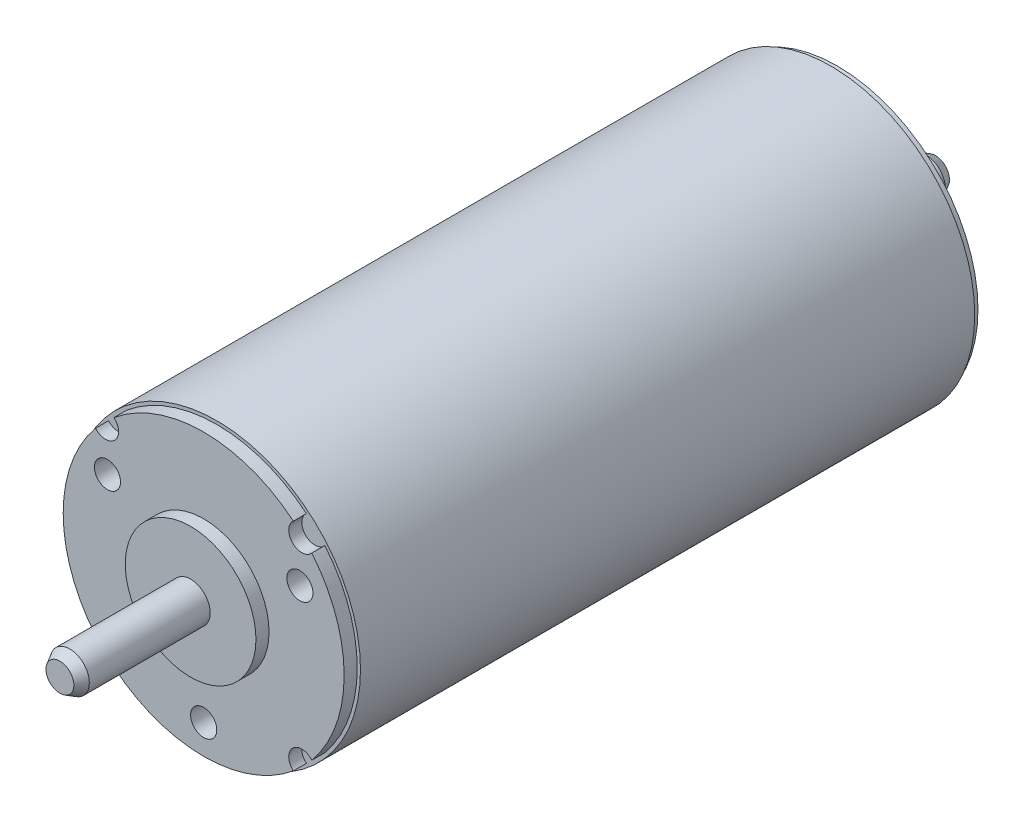
ISO-10303-21;
HEADER;
FILE_DESCRIPTION(('STEP AP214'),'2;1');
FILE_NAME('part.step','',(''),(''),'','','');
FILE_SCHEMA(('AUTOMOTIVE_DESIGN { 1 0 10303 214 1 1 1 1 }'));
ENDSEC;
DATA;
#1=APPLICATION_CONTEXT('core data for automotive mechanical design processes');
#2=APPLICATION_PROTOCOL_DEFINITION('international standard','automotive_design',2000,#1);
#3=PRODUCT_CONTEXT('',#1,'mechanical');
#4=PRODUCT('Part','Part','',(#3));
#5=PRODUCT_RELATED_PRODUCT_CATEGORY('part','',(#4));
#6=PRODUCT_DEFINITION_FORMATION('','',#4);
#7=PRODUCT_DEFINITION_CONTEXT('part definition',#1,'design');
#8=PRODUCT_DEFINITION('design','',#6,#7);
#9=PRODUCT_DEFINITION_SHAPE('','',#8);
#10=(LENGTH_UNIT() NAMED_UNIT(*) SI_UNIT(.MILLI.,.METRE.));
#11=(NAMED_UNIT(*) PLANE_ANGLE_UNIT() SI_UNIT($,.RADIAN.));
#12=(NAMED_UNIT(*) SI_UNIT($,.STERADIAN.) SOLID_ANGLE_UNIT());
#13=UNCERTAINTY_MEASURE_WITH_UNIT(LENGTH_MEASURE(1.E-05),#10,'distance_accuracy_value','');
#14=(GEOMETRIC_REPRESENTATION_CONTEXT(3) GLOBAL_UNCERTAINTY_ASSIGNED_CONTEXT((#13)) GLOBAL_UNIT_ASSIGNED_CONTEXT((#10,
#11,#12)) REPRESENTATION_CONTEXT('',''));
#15=CARTESIAN_POINT('',(0.,0.,0.));
#16=DIRECTION('',(0.,0.,1.));
#17=DIRECTION('',(1.,0.,0.));
#18=AXIS2_PLACEMENT_3D('',#15,#16,#17);
#19=CARTESIAN_POINT('',(0.,0.,48.));
#20=DIRECTION('',(0.,0.,1.));
#21=DIRECTION('',(1.,0.,0.));
#22=AXIS2_PLACEMENT_3D('',#19,#20,#21);
#23=PLANE('',#22);
#24=CARTESIAN_POINT('',(-7.36121593216777,4.24999999999993,48.));
#25=DIRECTION('',(0.,0.,1.));
#26=DIRECTION('',(-0.499999999999992,-0.866025403784443,0.));
#27=AXIS2_PLACEMENT_3D('',#24,#25,#26);
#28=CIRCLE('',#27,1.);
#29=CARTESIAN_POINT('',(-7.86121593216776,3.38397459621549,48.));
#30=VERTEX_POINT('',#29);
#31=EDGE_CURVE('E244',#30,#30,#28,.T.);
#32=ORIENTED_EDGE('',*,*,#31,.F.);
#33=EDGE_LOOP('',(#32));
#34=FACE_BOUND('',#33,.T.);
#35=CARTESIAN_POINT('',(7.36121593216771,4.25000000000003,48.));
#36=DIRECTION('',(0.,0.,1.));
#37=DIRECTION('',(-0.500000000000004,0.866025403784436,0.));
#38=AXIS2_PLACEMENT_3D('',#35,#36,#37);
#39=CIRCLE('',#38,1.);
#40=CARTESIAN_POINT('',(6.86121593216771,5.11602540378447,48.));
#41=VERTEX_POINT('',#40);
#42=EDGE_CURVE('E250',#41,#41,#39,.T.);
#43=ORIENTED_EDGE('',*,*,#42,.F.);
#44=EDGE_LOOP('',(#43));
#45=FACE_BOUND('',#44,.T.);
#46=CARTESIAN_POINT('',(0.,-8.5,48.));
#47=DIRECTION('',(0.,0.,1.));
#48=DIRECTION('',(1.,0.,0.));
#49=AXIS2_PLACEMENT_3D('',#46,#47,#48);
#50=CIRCLE('',#49,1.);
#51=CARTESIAN_POINT('',(1.,-8.5,48.));
#52=VERTEX_POINT('',#51);
#53=EDGE_CURVE('E256',#52,#52,#50,.T.);
#54=ORIENTED_EDGE('',*,*,#53,.F.);
#55=EDGE_LOOP('',(#54));
#56=FACE_BOUND('',#55,.T.);
#57=CARTESIAN_POINT('',(0.,0.,48.));
#58=DIRECTION('',(0.,0.,1.));
#59=DIRECTION('',(1.,0.,0.));
#60=AXIS2_PLACEMENT_3D('',#57,#58,#59);
#61=CIRCLE('',#60,5.);
#62=CARTESIAN_POINT('',(5.,0.,48.));
#63=VERTEX_POINT('',#62);
#64=EDGE_CURVE('E274',#63,#63,#61,.T.);
#65=ORIENTED_EDGE('',*,*,#64,.F.);
#66=EDGE_LOOP('',(#65));
#67=FACE_BOUND('',#66,.T.);
#68=CARTESIAN_POINT('',(0.,0.,48.));
#69=DIRECTION('',(0.,0.,1.));
#70=DIRECTION('',(1.,0.,0.));
#71=AXIS2_PLACEMENT_3D('',#68,#69,#70);
#72=CIRCLE('',#71,10.75);
#73=CARTESIAN_POINT('',(-6.86419451560961,-8.2731695046019,48.));
#74=VERTEX_POINT('',#73);
#75=CARTESIAN_POINT('',(6.86419451560979,-8.27316950460176,48.));
#76=VERTEX_POINT('',#75);
#77=EDGE_CURVE('E108',#74,#76,#72,.T.);
#78=ORIENTED_EDGE('',*,*,#77,.T.);
#79=CARTESIAN_POINT('',(7.5078760063017,-7.50787600630151,48.));
#80=DIRECTION('',(0.,0.,1.));
#81=DIRECTION('',(0.,-1.,0.));
#82=AXIS2_PLACEMENT_3D('',#79,#80,#81);
#83=CIRCLE('',#82,1.);
#84=CARTESIAN_POINT('',(8.27316950460192,-6.86419451560959,48.));
#85=VERTEX_POINT('',#84);
#86=EDGE_CURVE('E95',#76,#85,#83,.F.);
#87=ORIENTED_EDGE('',*,*,#86,.T.);
#88=CARTESIAN_POINT('',(8.27316950460183,6.8641945156097,48.));
#89=VERTEX_POINT('',#88);
#90=EDGE_CURVE('E116',#85,#89,#72,.T.);
#91=ORIENTED_EDGE('',*,*,#90,.T.);
#92=CARTESIAN_POINT('',(7.50787600630159,7.50787600630162,48.));
#93=DIRECTION('',(0.,0.,1.));
#94=DIRECTION('',(1.,0.,0.));
#95=AXIS2_PLACEMENT_3D('',#92,#93,#94);
#96=CIRCLE('',#95,1.);
#97=CARTESIAN_POINT('',(6.86419451560967,8.27316950460185,48.));
#98=VERTEX_POINT('',#97);
#99=EDGE_CURVE('E225',#89,#98,#96,.F.);
#100=ORIENTED_EDGE('',*,*,#99,.T.);
#101=CARTESIAN_POINT('',(-6.86419451560973,8.27316950460181,48.));
#102=VERTEX_POINT('',#101);
#103=EDGE_CURVE('E118',#98,#102,#72,.T.);
#104=ORIENTED_EDGE('',*,*,#103,.T.);
#105=CARTESIAN_POINT('',(-7.50787600630164,7.50787600630157,48.));
#106=DIRECTION('',(0.,0.,1.));
#107=DIRECTION('',(0.,1.,0.));
#108=AXIS2_PLACEMENT_3D('',#105,#106,#107);
#109=CIRCLE('',#108,1.);
#110=CARTESIAN_POINT('',(-8.27316950460188,6.86419451560964,48.));
#111=VERTEX_POINT('',#110);
#112=EDGE_CURVE('E321',#102,#111,#109,.F.);
#113=ORIENTED_EDGE('',*,*,#112,.T.);
#114=CARTESIAN_POINT('',(-8.27316950460178,-6.86419451560976,48.));
#115=VERTEX_POINT('',#114);
#116=EDGE_CURVE('E115',#111,#115,#72,.T.);
#117=ORIENTED_EDGE('',*,*,#116,.T.);
#118=CARTESIAN_POINT('',(-7.50787600630154,-7.50787600630167,48.));
#119=DIRECTION('',(0.,0.,1.));
#120=DIRECTION('',(-1.,0.,0.));
#121=AXIS2_PLACEMENT_3D('',#118,#119,#120);
#122=CIRCLE('',#121,1.);
#123=EDGE_CURVE('E114',#115,#74,#122,.F.);
#124=ORIENTED_EDGE('',*,*,#123,.T.);
#125=EDGE_LOOP('',(#78,#87,#91,#100,#104,#113,#117,#124));
#126=FACE_BOUND('',#125,.T.);
#127=ADVANCED_FACE('F32',(#34,#45,#56,#67,#126),#23,.T.);
#128=CARTESIAN_POINT('',(0.,0.,48.));
#129=DIRECTION('',(0.,0.,-1.));
#130=DIRECTION('',(-1.,0.,0.));
#131=AXIS2_PLACEMENT_3D('',#128,#129,#130);
#132=CYLINDRICAL_SURFACE('',#131,10.75);
#133=DIRECTION('',(0.,0.,1.));
#134=VECTOR('',#133,1.);
#135=CARTESIAN_POINT('',(6.86419451560979,-8.27316950460176,44.5034979931348));
#136=LINE('',#135,#134);
#137=CARTESIAN_POINT('',(6.86419451560979,-8.27316950460176,47.));
#138=VERTEX_POINT('',#137);
#139=EDGE_CURVE('E47',#138,#76,#136,.T.);
#140=ORIENTED_EDGE('',*,*,#139,.T.);
#141=ORIENTED_EDGE('',*,*,#77,.F.);
#142=DIRECTION('',(0.,0.,1.));
#143=VECTOR('',#142,1.);
#144=CARTESIAN_POINT('',(-6.86419451560961,-8.2731695046019,44.5034979931348));
#145=LINE('',#144,#143);
#146=CARTESIAN_POINT('',(-6.86419451560961,-8.2731695046019,47.));
#147=VERTEX_POINT('',#146);
#148=EDGE_CURVE('E322',#147,#74,#145,.T.);
#149=ORIENTED_EDGE('',*,*,#148,.F.);
#150=CARTESIAN_POINT('',(0.,0.,47.));
#151=DIRECTION('',(0.,0.,1.));
#152=DIRECTION('',(1.,0.,0.));
#153=AXIS2_PLACEMENT_3D('',#150,#151,#152);
#154=CIRCLE('',#153,10.75);
#155=EDGE_CURVE('E110',#147,#138,#154,.T.);
#156=ORIENTED_EDGE('',*,*,#155,.T.);
#157=EDGE_LOOP('',(#140,#141,#149,#156));
#158=FACE_BOUND('',#157,.T.);
#159=ADVANCED_FACE('F106',(#158),#132,.T.);
#160=DIRECTION('',(0.,0.,1.));
#161=VECTOR('',#160,1.);
#162=CARTESIAN_POINT('',(8.27316950460192,-6.86419451560959,44.5034979931348));
#163=LINE('',#162,#161);
#164=CARTESIAN_POINT('',(8.27316950460192,-6.86419451560959,47.));
#165=VERTEX_POINT('',#164);
#166=EDGE_CURVE('E98',#165,#85,#163,.T.);
#167=ORIENTED_EDGE('',*,*,#166,.F.);
#168=CARTESIAN_POINT('',(8.27316950460183,6.8641945156097,47.));
#169=VERTEX_POINT('',#168);
#170=EDGE_CURVE('E129',#165,#169,#154,.T.);
#171=ORIENTED_EDGE('',*,*,#170,.T.);
#172=DIRECTION('',(0.,0.,1.));
#173=VECTOR('',#172,1.);
#174=CARTESIAN_POINT('',(8.27316950460183,6.8641945156097,44.5034979931348));
#175=LINE('',#174,#173);
#176=EDGE_CURVE('E220',#169,#89,#175,.T.);
#177=ORIENTED_EDGE('',*,*,#176,.T.);
#178=ORIENTED_EDGE('',*,*,#90,.F.);
#179=EDGE_LOOP('',(#167,#171,#177,#178));
#180=FACE_BOUND('',#179,.T.);
#181=ADVANCED_FACE('F168',(#180),#132,.T.);
#182=DIRECTION('',(0.,0.,1.));
#183=VECTOR('',#182,1.);
#184=CARTESIAN_POINT('',(-8.27316950460178,-6.86419451560976,44.5034979931348));
#185=LINE('',#184,#183);
#186=CARTESIAN_POINT('',(-8.27316950460178,-6.86419451560976,47.));
#187=VERTEX_POINT('',#186);
#188=EDGE_CURVE('E55',#187,#115,#185,.T.);
#189=ORIENTED_EDGE('',*,*,#188,.T.);
#190=ORIENTED_EDGE('',*,*,#116,.F.);
#191=DIRECTION('',(0.,0.,1.));
#192=VECTOR('',#191,1.);
#193=CARTESIAN_POINT('',(-8.27316950460188,6.86419451560964,44.5034979931348));
#194=LINE('',#193,#192);
#195=CARTESIAN_POINT('',(-8.27316950460188,6.86419451560964,47.));
#196=VERTEX_POINT('',#195);
#197=EDGE_CURVE('E319',#196,#111,#194,.T.);
#198=ORIENTED_EDGE('',*,*,#197,.F.);
#199=EDGE_CURVE('E128',#196,#187,#154,.T.);
#200=ORIENTED_EDGE('',*,*,#199,.T.);
#201=EDGE_LOOP('',(#189,#190,#198,#200));
#202=FACE_BOUND('',#201,.T.);
#203=ADVANCED_FACE('F179',(#202),#132,.T.);
#204=DIRECTION('',(0.,0.,1.));
#205=VECTOR('',#204,1.);
#206=CARTESIAN_POINT('',(-6.86419451560973,8.27316950460181,44.5034979931348));
#207=LINE('',#206,#205);
#208=CARTESIAN_POINT('',(-6.86419451560973,8.27316950460181,47.));
#209=VERTEX_POINT('',#208);
#210=EDGE_CURVE('E215',#209,#102,#207,.T.);
#211=ORIENTED_EDGE('',*,*,#210,.T.);
#212=ORIENTED_EDGE('',*,*,#103,.F.);
#213=DIRECTION('',(0.,0.,1.));
#214=VECTOR('',#213,1.);
#215=CARTESIAN_POINT('',(6.86419451560967,8.27316950460185,44.5034979931348));
#216=LINE('',#215,#214);
#217=CARTESIAN_POINT('',(6.86419451560967,8.27316950460185,47.));
#218=VERTEX_POINT('',#217);
#219=EDGE_CURVE('E216',#218,#98,#216,.T.);
#220=ORIENTED_EDGE('',*,*,#219,.F.);
#221=EDGE_CURVE('E119',#218,#209,#154,.T.);
#222=ORIENTED_EDGE('',*,*,#221,.T.);
#223=EDGE_LOOP('',(#211,#212,#220,#222));
#224=FACE_BOUND('',#223,.T.);
#225=ADVANCED_FACE('F170',(#224),#132,.T.);
#226=CARTESIAN_POINT('',(0.,0.,-1.5));
#227=DIRECTION('',(0.,0.,-1.));
#228=DIRECTION('',(-1.,0.,0.));
#229=AXIS2_PLACEMENT_3D('',#226,#227,#228);
#230=PLANE('',#229);
#231=CARTESIAN_POINT('',(0.,0.,-1.5));
#232=DIRECTION('',(0.,0.,-1.));
#233=DIRECTION('',(-1.,0.,0.));
#234=AXIS2_PLACEMENT_3D('',#231,#232,#233);
#235=CIRCLE('',#234,5.);
#236=CARTESIAN_POINT('',(-5.,0.,-1.5));
#237=VERTEX_POINT('',#236);
#238=EDGE_CURVE('E271',#237,#237,#235,.T.);
#239=ORIENTED_EDGE('',*,*,#238,.T.);
#240=EDGE_LOOP('',(#239));
#241=FACE_BOUND('',#240,.T.);
#242=CARTESIAN_POINT('',(0.,0.,-1.5));
#243=DIRECTION('',(0.,0.,-1.));
#244=DIRECTION('',(-1.,0.,0.));
#245=AXIS2_PLACEMENT_3D('',#242,#243,#244);
#246=CIRCLE('',#245,1.5);
#247=CARTESIAN_POINT('',(1.5,0.,-1.5));
#248=VERTEX_POINT('',#247);
#249=EDGE_CURVE('E262',#248,#248,#246,.T.);
#250=ORIENTED_EDGE('',*,*,#249,.F.);
#251=EDGE_LOOP('',(#250));
#252=FACE_BOUND('',#251,.T.);
#253=ADVANCED_FACE('F178',(#241,#252),#230,.T.);
#254=CARTESIAN_POINT('',(0.,0.,49.));
#255=DIRECTION('',(0.,0.,1.));
#256=DIRECTION('',(1.,0.,0.));
#257=AXIS2_PLACEMENT_3D('',#254,#255,#256);
#258=PLANE('',#257);
#259=CARTESIAN_POINT('',(0.,0.,49.));
#260=DIRECTION('',(0.,0.,1.));
#261=DIRECTION('',(1.,0.,0.));
#262=AXIS2_PLACEMENT_3D('',#259,#260,#261);
#263=CIRCLE('',#262,5.);
#264=CARTESIAN_POINT('',(5.,0.,49.));
#265=VERTEX_POINT('',#264);
#266=EDGE_CURVE('E277',#265,#265,#263,.T.);
#267=ORIENTED_EDGE('',*,*,#266,.T.);
#268=EDGE_LOOP('',(#267));
#269=FACE_BOUND('',#268,.T.);
#270=CARTESIAN_POINT('',(0.,0.,49.));
#271=DIRECTION('',(0.,0.,1.));
#272=DIRECTION('',(1.,0.,0.));
#273=AXIS2_PLACEMENT_3D('',#270,#271,#272);
#274=CIRCLE('',#273,1.5);
#275=CARTESIAN_POINT('',(1.5,0.,49.));
#276=VERTEX_POINT('',#275);
#277=EDGE_CURVE('E267',#276,#276,#274,.T.);
#278=ORIENTED_EDGE('',*,*,#277,.F.);
#279=EDGE_LOOP('',(#278));
#280=FACE_BOUND('',#279,.T.);
#281=ADVANCED_FACE('F295',(#269,#280),#258,.T.);
#282=CARTESIAN_POINT('',(0.,0.,-0.5));
#283=DIRECTION('',(0.,0.,-1.));
#284=DIRECTION('',(-1.,0.,0.));
#285=AXIS2_PLACEMENT_3D('',#282,#283,#284);
#286=PLANE('',#285);
#287=CARTESIAN_POINT('',(6.49519052838332,3.74999999999994,-0.5));
#288=DIRECTION('',(0.,0.,-1.));
#289=DIRECTION('',(0.499999999999992,-0.866025403784443,0.));
#290=AXIS2_PLACEMENT_3D('',#287,#288,#289);
#291=CIRCLE('',#290,0.8);
#292=CARTESIAN_POINT('',(6.89519052838332,3.05717967697238,-0.5));
#293=VERTEX_POINT('',#292);
#294=EDGE_CURVE('E222',#293,#293,#291,.T.);
#295=ORIENTED_EDGE('',*,*,#294,.F.);
#296=EDGE_LOOP('',(#295));
#297=FACE_BOUND('',#296,.T.);
#298=CARTESIAN_POINT('',(-6.49519052838327,3.75000000000003,-0.5));
#299=DIRECTION('',(0.,0.,-1.));
#300=DIRECTION('',(0.500000000000004,0.866025403784436,0.));
#301=AXIS2_PLACEMENT_3D('',#298,#299,#300);
#302=CIRCLE('',#301,0.8);
#303=CARTESIAN_POINT('',(-6.09519052838327,4.44282032302758,-0.5));
#304=VERTEX_POINT('',#303);
#305=EDGE_CURVE('E232',#304,#304,#302,.T.);
#306=ORIENTED_EDGE('',*,*,#305,.F.);
#307=EDGE_LOOP('',(#306));
#308=FACE_BOUND('',#307,.T.);
#309=CARTESIAN_POINT('',(0.,-7.5,-0.5));
#310=DIRECTION('',(0.,0.,-1.));
#311=DIRECTION('',(-1.,0.,0.));
#312=AXIS2_PLACEMENT_3D('',#309,#310,#311);
#313=CIRCLE('',#312,0.8);
#314=CARTESIAN_POINT('',(-0.8,-7.5,-0.5));
#315=VERTEX_POINT('',#314);
#316=EDGE_CURVE('E238',#315,#315,#313,.T.);
#317=ORIENTED_EDGE('',*,*,#316,.F.);
#318=EDGE_LOOP('',(#317));
#319=FACE_BOUND('',#318,.T.);
#320=CARTESIAN_POINT('',(0.,0.,-0.5));
#321=DIRECTION('',(0.,0.,-1.));
#322=DIRECTION('',(-1.,0.,0.));
#323=AXIS2_PLACEMENT_3D('',#320,#321,#322);
#324=CIRCLE('',#323,10.75);
#325=CARTESIAN_POINT('',(-10.75,0.,-0.5));
#326=VERTEX_POINT('',#325);
#327=EDGE_CURVE('E124',#326,#326,#324,.T.);
#328=ORIENTED_EDGE('',*,*,#327,.T.);
#329=EDGE_LOOP('',(#328));
#330=FACE_BOUND('',#329,.T.);
#331=CARTESIAN_POINT('',(0.,0.,-0.5));
#332=DIRECTION('',(0.,0.,-1.));
#333=DIRECTION('',(-1.,0.,0.));
#334=AXIS2_PLACEMENT_3D('',#331,#332,#333);
#335=CIRCLE('',#334,5.);
#336=CARTESIAN_POINT('',(-5.,0.,-0.5));
#337=VERTEX_POINT('',#336);
#338=EDGE_CURVE('E270',#337,#337,#335,.T.);
#339=ORIENTED_EDGE('',*,*,#338,.F.);
#340=EDGE_LOOP('',(#339));
#341=FACE_BOUND('',#340,.T.);
#342=ADVANCED_FACE('F189',(#297,#308,#319,#330,#341),#286,.T.);
#343=CARTESIAN_POINT('',(0.,0.,0.));
#344=DIRECTION('',(0.,0.,1.));
#345=DIRECTION('',(1.,0.,0.));
#346=AXIS2_PLACEMENT_3D('',#343,#344,#345);
#347=PLANE('',#346);
#348=CARTESIAN_POINT('',(0.,0.,0.));
#349=DIRECTION('',(0.,0.,1.));
#350=DIRECTION('',(1.,0.,0.));
#351=AXIS2_PLACEMENT_3D('',#348,#349,#350);
#352=CIRCLE('',#351,11.);
#353=CARTESIAN_POINT('',(11.,0.,0.));
#354=VERTEX_POINT('',#353);
#355=EDGE_CURVE('E123',#354,#354,#352,.T.);
#356=ORIENTED_EDGE('',*,*,#355,.F.);
#357=EDGE_LOOP('',(#356));
#358=FACE_BOUND('',#357,.T.);
#359=CARTESIAN_POINT('',(0.,0.,0.));
#360=DIRECTION('',(0.,0.,1.));
#361=DIRECTION('',(1.,0.,0.));
#362=AXIS2_PLACEMENT_3D('',#359,#360,#361);
#363=CIRCLE('',#362,10.75);
#364=CARTESIAN_POINT('',(10.75,0.,0.));
#365=VERTEX_POINT('',#364);
#366=EDGE_CURVE('E133',#365,#365,#363,.F.);
#367=ORIENTED_EDGE('',*,*,#366,.F.);
#368=EDGE_LOOP('',(#367));
#369=FACE_BOUND('',#368,.T.);
#370=ADVANCED_FACE('F185',(#358,#369),#347,.F.);
#371=CARTESIAN_POINT('',(0.,0.,47.));
#372=DIRECTION('',(0.,0.,1.));
#373=DIRECTION('',(1.,0.,0.));
#374=AXIS2_PLACEMENT_3D('',#371,#372,#373);
#375=PLANE('',#374);
#376=CARTESIAN_POINT('',(0.,0.,47.));
#377=DIRECTION('',(0.,0.,1.));
#378=DIRECTION('',(1.,0.,0.));
#379=AXIS2_PLACEMENT_3D('',#376,#377,#378);
#380=CIRCLE('',#379,11.);
#381=CARTESIAN_POINT('',(11.,0.,47.));
#382=VERTEX_POINT('',#381);
#383=EDGE_CURVE('E130',#382,#382,#380,.T.);
#384=ORIENTED_EDGE('',*,*,#383,.T.);
#385=EDGE_LOOP('',(#384));
#386=FACE_BOUND('',#385,.T.);
#387=ORIENTED_EDGE('',*,*,#221,.F.);
#388=CARTESIAN_POINT('',(7.50787600630159,7.50787600630162,47.));
#389=DIRECTION('',(0.,0.,1.));
#390=DIRECTION('',(1.,0.,0.));
#391=AXIS2_PLACEMENT_3D('',#388,#389,#390);
#392=CIRCLE('',#391,1.);
#393=EDGE_CURVE('E209',#218,#169,#392,.T.);
#394=ORIENTED_EDGE('',*,*,#393,.T.);
#395=ORIENTED_EDGE('',*,*,#170,.F.);
#396=CARTESIAN_POINT('',(7.5078760063017,-7.50787600630151,47.));
#397=DIRECTION('',(0.,0.,1.));
#398=DIRECTION('',(1.,0.,0.));
#399=AXIS2_PLACEMENT_3D('',#396,#397,#398);
#400=CIRCLE('',#399,1.);
#401=EDGE_CURVE('E329',#165,#138,#400,.T.);
#402=ORIENTED_EDGE('',*,*,#401,.T.);
#403=ORIENTED_EDGE('',*,*,#155,.F.);
#404=CARTESIAN_POINT('',(-7.50787600630154,-7.50787600630167,47.));
#405=DIRECTION('',(0.,0.,1.));
#406=DIRECTION('',(1.,0.,0.));
#407=AXIS2_PLACEMENT_3D('',#404,#405,#406);
#408=CIRCLE('',#407,1.);
#409=EDGE_CURVE('E320',#147,#187,#408,.T.);
#410=ORIENTED_EDGE('',*,*,#409,.T.);
#411=ORIENTED_EDGE('',*,*,#199,.F.);
#412=CARTESIAN_POINT('',(-7.50787600630164,7.50787600630157,47.));
#413=DIRECTION('',(0.,0.,1.));
#414=DIRECTION('',(1.,0.,0.));
#415=AXIS2_PLACEMENT_3D('',#412,#413,#414);
#416=CIRCLE('',#415,1.);
#417=EDGE_CURVE('E211',#196,#209,#416,.T.);
#418=ORIENTED_EDGE('',*,*,#417,.T.);
#419=EDGE_LOOP('',(#387,#394,#395,#402,#403,#410,#411,#418));
#420=FACE_BOUND('',#419,.T.);
#421=ADVANCED_FACE('F181',(#386,#420),#375,.T.);
#422=CARTESIAN_POINT('',(0.,0.,47.));
#423=DIRECTION('',(0.,0.,-1.));
#424=DIRECTION('',(-1.,0.,0.));
#425=AXIS2_PLACEMENT_3D('',#422,#423,#424);
#426=CYLINDRICAL_SURFACE('',#425,11.);
#427=ORIENTED_EDGE('',*,*,#383,.F.);
#428=EDGE_LOOP('',(#427));
#429=FACE_BOUND('',#428,.T.);
#430=ORIENTED_EDGE('',*,*,#355,.T.);
#431=EDGE_LOOP('',(#430));
#432=FACE_BOUND('',#431,.T.);
#433=ADVANCED_FACE('F184',(#429,#432),#426,.T.);
#434=CARTESIAN_POINT('',(0.,0.,-0.5));
#435=DIRECTION('',(0.,0.,1.));
#436=DIRECTION('',(1.,0.,0.));
#437=AXIS2_PLACEMENT_3D('',#434,#435,#436);
#438=CYLINDRICAL_SURFACE('',#437,10.75);
#439=ORIENTED_EDGE('',*,*,#327,.F.);
#440=EDGE_LOOP('',(#439));
#441=FACE_BOUND('',#440,.T.);
#442=ORIENTED_EDGE('',*,*,#366,.T.);
#443=EDGE_LOOP('',(#442));
#444=FACE_BOUND('',#443,.T.);
#445=ADVANCED_FACE('F174',(#441,#444),#438,.T.);
#446=CARTESIAN_POINT('',(0.,0.,49.));
#447=DIRECTION('',(0.,0.,-1.));
#448=DIRECTION('',(-1.,0.,0.));
#449=AXIS2_PLACEMENT_3D('',#446,#447,#448);
#450=CYLINDRICAL_SURFACE('',#449,5.);
#451=ORIENTED_EDGE('',*,*,#266,.F.);
#452=EDGE_LOOP('',(#451));
#453=FACE_BOUND('',#452,.T.);
#454=ORIENTED_EDGE('',*,*,#64,.T.);
#455=EDGE_LOOP('',(#454));
#456=FACE_BOUND('',#455,.T.);
#457=ADVANCED_FACE('F196',(#453,#456),#450,.T.);
#458=CARTESIAN_POINT('',(0.,0.,-1.5));
#459=DIRECTION('',(0.,0.,1.));
#460=DIRECTION('',(1.,0.,0.));
#461=AXIS2_PLACEMENT_3D('',#458,#459,#460);
#462=CYLINDRICAL_SURFACE('',#461,5.);
#463=ORIENTED_EDGE('',*,*,#238,.F.);
#464=EDGE_LOOP('',(#463));
#465=FACE_BOUND('',#464,.T.);
#466=ORIENTED_EDGE('',*,*,#338,.T.);
#467=EDGE_LOOP('',(#466));
#468=FACE_BOUND('',#467,.T.);
#469=ADVANCED_FACE('F284',(#465,#468),#462,.T.);
#470=CARTESIAN_POINT('',(0.,0.,59.));
#471=DIRECTION('',(0.,0.,-1.));
#472=DIRECTION('',(-1.,0.,0.));
#473=AXIS2_PLACEMENT_3D('',#470,#471,#472);
#474=CYLINDRICAL_SURFACE('',#473,1.5);
#475=CARTESIAN_POINT('',(0.,0.,58.25));
#476=DIRECTION('',(0.,0.,1.));
#477=DIRECTION('',(1.,0.,0.));
#478=AXIS2_PLACEMENT_3D('',#475,#476,#477);
#479=CIRCLE('',#478,1.5);
#480=CARTESIAN_POINT('',(1.5,0.,58.25));
#481=VERTEX_POINT('',#480);
#482=EDGE_CURVE('E11',#481,#481,#479,.F.);
#483=ORIENTED_EDGE('',*,*,#482,.T.);
#484=EDGE_LOOP('',(#483));
#485=FACE_BOUND('',#484,.T.);
#486=ORIENTED_EDGE('',*,*,#277,.T.);
#487=EDGE_LOOP('',(#486));
#488=FACE_BOUND('',#487,.T.);
#489=ADVANCED_FACE('F290',(#485,#488),#474,.T.);
#490=CARTESIAN_POINT('',(0.,0.,59.));
#491=DIRECTION('',(0.,0.,1.));
#492=DIRECTION('',(1.,0.,0.));
#493=AXIS2_PLACEMENT_3D('',#490,#491,#492);
#494=PLANE('',#493);
#495=CARTESIAN_POINT('',(0.,0.,59.));
#496=DIRECTION('',(0.,0.,1.));
#497=DIRECTION('',(1.,0.,0.));
#498=AXIS2_PLACEMENT_3D('',#495,#496,#497);
#499=CIRCLE('',#498,1.06698729810779);
#500=CARTESIAN_POINT('',(1.06698729810779,0.,59.));
#501=VERTEX_POINT('',#500);
#502=EDGE_CURVE('E40',#501,#501,#499,.T.);
#503=ORIENTED_EDGE('',*,*,#502,.T.);
#504=EDGE_LOOP('',(#503));
#505=FACE_BOUND('',#504,.T.);
#506=ADVANCED_FACE('F146',(#505),#494,.T.);
#507=CARTESIAN_POINT('',(0.,0.,-8.));
#508=DIRECTION('',(0.,0.,1.));
#509=DIRECTION('',(1.,0.,0.));
#510=AXIS2_PLACEMENT_3D('',#507,#508,#509);
#511=CYLINDRICAL_SURFACE('',#510,1.5);
#512=CARTESIAN_POINT('',(0.,0.,-7.25000000000008));
#513=DIRECTION('',(0.,0.,-1.));
#514=DIRECTION('',(-1.,0.,0.));
#515=AXIS2_PLACEMENT_3D('',#512,#513,#514);
#516=CIRCLE('',#515,1.5);
#517=CARTESIAN_POINT('',(1.5,0.,-7.25000000000008));
#518=VERTEX_POINT('',#517);
#519=EDGE_CURVE('E141',#518,#518,#516,.F.);
#520=CARTESIAN_POINT('',(1.5,0.,-7.25000000000008));
#521=CARTESIAN_POINT('',(1.5,0.,-7.19010416666675));
#522=CARTESIAN_POINT('',(1.5,0.,-7.13020833333341));
#523=CARTESIAN_POINT('',(1.5,0.,-7.01041666666674));
#524=CARTESIAN_POINT('',(1.5,0.,-6.95052083333341));
#525=CARTESIAN_POINT('',(1.5,0.,-6.83072916666674));
#526=CARTESIAN_POINT('',(1.5,0.,-6.77083333333341));
#527=CARTESIAN_POINT('',(1.5,0.,-6.65104166666674));
#528=CARTESIAN_POINT('',(1.5,0.,-6.5911458333334));
#529=CARTESIAN_POINT('',(1.5,0.,-6.47135416666674));
#530=CARTESIAN_POINT('',(1.5,0.,-6.4114583333334));
#531=CARTESIAN_POINT('',(1.5,0.,-6.29166666666673));
#532=CARTESIAN_POINT('',(1.5,0.,-6.2317708333334));
#533=CARTESIAN_POINT('',(1.5,0.,-6.11197916666673));
#534=CARTESIAN_POINT('',(1.5,0.,-6.0520833333334));
#535=CARTESIAN_POINT('',(1.5,0.,-5.93229166666673));
#536=CARTESIAN_POINT('',(1.5,0.,-5.8723958333334));
#537=CARTESIAN_POINT('',(1.5,0.,-5.75260416666673));
#538=CARTESIAN_POINT('',(1.5,0.,-5.69270833333339));
#539=CARTESIAN_POINT('',(1.5,0.,-5.57291666666672));
#540=CARTESIAN_POINT('',(1.5,0.,-5.51302083333339));
#541=CARTESIAN_POINT('',(1.5,0.,-5.39322916666672));
#542=CARTESIAN_POINT('',(1.5,0.,-5.33333333333339));
#543=CARTESIAN_POINT('',(1.5,0.,-5.21354166666672));
#544=CARTESIAN_POINT('',(1.5,0.,-5.15364583333339));
#545=CARTESIAN_POINT('',(1.5,0.,-5.03385416666672));
#546=CARTESIAN_POINT('',(1.5,0.,-4.97395833333338));
#547=CARTESIAN_POINT('',(1.5,0.,-4.85416666666671));
#548=CARTESIAN_POINT('',(1.5,0.,-4.79427083333338));
#549=CARTESIAN_POINT('',(1.5,0.,-4.67447916666671));
#550=CARTESIAN_POINT('',(1.5,0.,-4.61458333333338));
#551=CARTESIAN_POINT('',(1.5,0.,-4.49479166666671));
#552=CARTESIAN_POINT('',(1.5,0.,-4.43489583333337));
#553=CARTESIAN_POINT('',(1.5,0.,-4.31510416666671));
#554=CARTESIAN_POINT('',(1.5,0.,-4.25520833333337));
#555=CARTESIAN_POINT('',(1.5,0.,-4.1354166666667));
#556=CARTESIAN_POINT('',(1.5,0.,-4.07552083333337));
#557=CARTESIAN_POINT('',(1.5,0.,-3.9557291666667));
#558=CARTESIAN_POINT('',(1.5,0.,-3.89583333333337));
#559=CARTESIAN_POINT('',(1.5,0.,-3.7760416666667));
#560=CARTESIAN_POINT('',(1.5,0.,-3.71614583333337));
#561=CARTESIAN_POINT('',(1.5,0.,-3.5963541666667));
#562=CARTESIAN_POINT('',(1.5,0.,-3.53645833333336));
#563=CARTESIAN_POINT('',(1.5,0.,-3.41666666666669));
#564=CARTESIAN_POINT('',(1.5,0.,-3.35677083333336));
#565=CARTESIAN_POINT('',(1.5,0.,-3.23697916666669));
#566=CARTESIAN_POINT('',(1.5,0.,-3.17708333333336));
#567=CARTESIAN_POINT('',(1.5,0.,-3.05729166666669));
#568=CARTESIAN_POINT('',(1.5,0.,-2.99739583333335));
#569=CARTESIAN_POINT('',(1.5,0.,-2.87760416666669));
#570=CARTESIAN_POINT('',(1.5,0.,-2.81770833333335));
#571=CARTESIAN_POINT('',(1.5,0.,-2.69791666666668));
#572=CARTESIAN_POINT('',(1.5,0.,-2.63802083333335));
#573=CARTESIAN_POINT('',(1.5,0.,-2.51822916666668));
#574=CARTESIAN_POINT('',(1.5,0.,-2.45833333333335));
#575=CARTESIAN_POINT('',(1.5,0.,-2.33854166666668));
#576=CARTESIAN_POINT('',(1.5,0.,-2.27864583333334));
#577=CARTESIAN_POINT('',(1.5,0.,-2.15885416666668));
#578=CARTESIAN_POINT('',(1.5,0.,-2.09895833333334));
#579=CARTESIAN_POINT('',(1.5,0.,-1.97916666666667));
#580=CARTESIAN_POINT('',(1.5,0.,-1.91927083333334));
#581=CARTESIAN_POINT('',(1.5,0.,-1.79947916666667));
#582=CARTESIAN_POINT('',(1.5,0.,-1.73958333333334));
#583=CARTESIAN_POINT('',(1.5,0.,-1.61979166666667));
#584=CARTESIAN_POINT('',(1.5,0.,-1.55989583333333));
#585=CARTESIAN_POINT('',(1.5,0.,-1.5));
#586=B_SPLINE_CURVE_WITH_KNOTS('',3,(#520,#521,#522,#523,#524,#525,#526,#527,#528,#529,#530,
#531,#532,#533,#534,#535,#536,#537,#538,#539,#540,#541,#542,#543,#544,#545,#546,#547,#548,#549,
#550,#551,#552,#553,#554,#555,#556,#557,#558,#559,#560,#561,#562,#563,#564,#565,#566,#567,#568,
#569,#570,#571,#572,#573,#574,#575,#576,#577,#578,#579,#580,#581,#582,#583,#584,#585),
.UNSPECIFIED.,.F.,.F.,(4,2,2,2,2,2,2,2,2,2,2,2,2,2,2,2,2,2,2,2,2,2,2,2,2,2,2,2,2,2,2,2,4),(0.,
0.179687500000002,0.359375000000005,0.539062500000007,0.718750000000009,0.898437500000012,
1.07812500000001,1.25781250000002,1.43750000000002,1.61718750000002,1.79687500000003,
1.97656250000003,2.15625000000003,2.33593750000003,2.51562500000003,2.69531250000004,
2.87500000000004,3.05468750000004,3.23437500000004,3.41406250000005,3.59375000000005,
3.77343750000005,3.95312500000005,4.13281250000006,4.31250000000006,4.49218750000006,
4.67187500000006,4.85156250000007,5.03125000000007,5.21093750000007,5.39062500000007,
5.57031250000008,5.75000000000008),.UNSPECIFIED.);
#587=EDGE_CURVE('BSEAM564',#518,#248,#586,.T.);
#588=ORIENTED_EDGE('',*,*,#519,.T.);
#589=ORIENTED_EDGE('',*,*,#249,.T.);
#590=ORIENTED_EDGE('',*,*,#587,.T.);
#591=ORIENTED_EDGE('',*,*,#587,.F.);
#592=EDGE_LOOP('',(#588,#590,#589,#591));
#593=FACE_BOUND('',#592,.T.);
#594=ADVANCED_FACE('F564',(#593),#511,.T.);
#595=CARTESIAN_POINT('',(0.,0.,-8.));
#596=DIRECTION('',(0.,0.,-1.));
#597=DIRECTION('',(-1.,0.,0.));
#598=AXIS2_PLACEMENT_3D('',#595,#596,#597);
#599=PLANE('',#598);
#600=CARTESIAN_POINT('',(0.,0.,-8.));
#601=DIRECTION('',(0.,0.,-1.));
#602=DIRECTION('',(-1.,0.,0.));
#603=AXIS2_PLACEMENT_3D('',#600,#601,#602);
#604=CIRCLE('',#603,1.06698729810784);
#605=CARTESIAN_POINT('',(-1.06698729810784,0.,-8.));
#606=VERTEX_POINT('',#605);
#607=EDGE_CURVE('E138',#606,#606,#604,.T.);
#608=ORIENTED_EDGE('',*,*,#607,.T.);
#609=EDGE_LOOP('',(#608));
#610=FACE_BOUND('',#609,.T.);
#611=ADVANCED_FACE('F159',(#610),#599,.T.);
#612=CARTESIAN_POINT('',(0.,0.,-8.));
#613=DIRECTION('',(0.,0.,1.));
#614=DIRECTION('',(1.,0.,0.));
#615=AXIS2_PLACEMENT_3D('',#612,#613,#614);
#616=CONICAL_SURFACE('',#615,1.06698729810784,0.523598775598291);
#617=ORIENTED_EDGE('',*,*,#519,.F.);
#618=EDGE_LOOP('',(#617));
#619=FACE_BOUND('',#618,.T.);
#620=ORIENTED_EDGE('',*,*,#607,.F.);
#621=EDGE_LOOP('',(#620));
#622=FACE_BOUND('',#621,.T.);
#623=ADVANCED_FACE('F150',(#619,#622),#616,.T.);
#624=CARTESIAN_POINT('',(0.,0.,59.));
#625=DIRECTION('',(0.,0.,-1.));
#626=DIRECTION('',(-1.,0.,0.));
#627=AXIS2_PLACEMENT_3D('',#624,#625,#626);
#628=CONICAL_SURFACE('',#627,1.06698729810779,0.523598775598294);
#629=ORIENTED_EDGE('',*,*,#482,.F.);
#630=EDGE_LOOP('',(#629));
#631=FACE_BOUND('',#630,.T.);
#632=ORIENTED_EDGE('',*,*,#502,.F.);
#633=EDGE_LOOP('',(#632));
#634=FACE_BOUND('',#633,.T.);
#635=ADVANCED_FACE('F34',(#631,#634),#628,.T.);
#636=CARTESIAN_POINT('',(0.,-8.5,45.));
#637=DIRECTION('',(0.,0.,1.));
#638=DIRECTION('',(1.,0.,0.));
#639=AXIS2_PLACEMENT_3D('',#636,#637,#638);
#640=CYLINDRICAL_SURFACE('',#639,1.);
#641=CARTESIAN_POINT('',(0.,-8.5,45.));
#642=DIRECTION('',(0.,0.,1.));
#643=DIRECTION('',(1.,0.,0.));
#644=AXIS2_PLACEMENT_3D('',#641,#642,#643);
#645=CIRCLE('',#644,1.);
#646=CARTESIAN_POINT('',(1.,-8.5,45.));
#647=VERTEX_POINT('',#646);
#648=EDGE_CURVE('E259',#647,#647,#645,.T.);
#649=ORIENTED_EDGE('',*,*,#648,.F.);
#650=EDGE_LOOP('',(#649));
#651=FACE_BOUND('',#650,.T.);
#652=ORIENTED_EDGE('',*,*,#53,.T.);
#653=EDGE_LOOP('',(#652));
#654=FACE_BOUND('',#653,.T.);
#655=ADVANCED_FACE('F149',(#651,#654),#640,.F.);
#656=CARTESIAN_POINT('',(0.,-8.5,45.));
#657=DIRECTION('',(0.,0.,1.));
#658=DIRECTION('',(1.,0.,0.));
#659=AXIS2_PLACEMENT_3D('',#656,#657,#658);
#660=PLANE('',#659);
#661=ORIENTED_EDGE('',*,*,#648,.T.);
#662=EDGE_LOOP('',(#661));
#663=FACE_BOUND('',#662,.T.);
#664=ADVANCED_FACE('F156',(#663),#660,.T.);
#665=CARTESIAN_POINT('',(7.36121593216771,4.25000000000003,45.));
#666=DIRECTION('',(0.,0.,1.));
#667=DIRECTION('',(1.,0.,0.));
#668=AXIS2_PLACEMENT_3D('',#665,#666,#667);
#669=CYLINDRICAL_SURFACE('',#668,1.);
#670=CARTESIAN_POINT('',(7.36121593216771,4.25000000000003,45.));
#671=DIRECTION('',(0.,0.,1.));
#672=DIRECTION('',(-0.500000000000004,0.866025403784436,0.));
#673=AXIS2_PLACEMENT_3D('',#670,#671,#672);
#674=CIRCLE('',#673,1.);
#675=CARTESIAN_POINT('',(6.86121593216771,5.11602540378447,45.));
#676=VERTEX_POINT('',#675);
#677=EDGE_CURVE('E253',#676,#676,#674,.T.);
#678=ORIENTED_EDGE('',*,*,#677,.F.);
#679=EDGE_LOOP('',(#678));
#680=FACE_BOUND('',#679,.T.);
#681=ORIENTED_EDGE('',*,*,#42,.T.);
#682=EDGE_LOOP('',(#681));
#683=FACE_BOUND('',#682,.T.);
#684=ADVANCED_FACE('F520',(#680,#683),#669,.F.);
#685=CARTESIAN_POINT('',(7.36121593216771,4.25000000000003,45.));
#686=DIRECTION('',(0.,0.,1.));
#687=DIRECTION('',(-0.500000000000004,0.866025403784436,0.));
#688=AXIS2_PLACEMENT_3D('',#685,#686,#687);
#689=PLANE('',#688);
#690=ORIENTED_EDGE('',*,*,#677,.T.);
#691=EDGE_LOOP('',(#690));
#692=FACE_BOUND('',#691,.T.);
#693=ADVANCED_FACE('F510',(#692),#689,.T.);
#694=CARTESIAN_POINT('',(-7.36121593216777,4.24999999999993,45.));
#695=DIRECTION('',(0.,0.,1.));
#696=DIRECTION('',(1.,0.,0.));
#697=AXIS2_PLACEMENT_3D('',#694,#695,#696);
#698=CYLINDRICAL_SURFACE('',#697,1.);
#699=CARTESIAN_POINT('',(-7.36121593216777,4.24999999999993,45.));
#700=DIRECTION('',(0.,0.,1.));
#701=DIRECTION('',(-0.499999999999992,-0.866025403784443,0.));
#702=AXIS2_PLACEMENT_3D('',#699,#700,#701);
#703=CIRCLE('',#702,1.);
#704=CARTESIAN_POINT('',(-7.86121593216776,3.38397459621549,45.));
#705=VERTEX_POINT('',#704);
#706=EDGE_CURVE('E247',#705,#705,#703,.T.);
#707=ORIENTED_EDGE('',*,*,#706,.F.);
#708=EDGE_LOOP('',(#707));
#709=FACE_BOUND('',#708,.T.);
#710=ORIENTED_EDGE('',*,*,#31,.T.);
#711=EDGE_LOOP('',(#710));
#712=FACE_BOUND('',#711,.T.);
#713=ADVANCED_FACE('F500',(#709,#712),#698,.F.);
#714=CARTESIAN_POINT('',(-7.36121593216777,4.24999999999993,45.));
#715=DIRECTION('',(0.,0.,1.));
#716=DIRECTION('',(-0.499999999999992,-0.866025403784443,0.));
#717=AXIS2_PLACEMENT_3D('',#714,#715,#716);
#718=PLANE('',#717);
#719=ORIENTED_EDGE('',*,*,#706,.T.);
#720=EDGE_LOOP('',(#719));
#721=FACE_BOUND('',#720,.T.);
#722=ADVANCED_FACE('F490',(#721),#718,.T.);
#723=CARTESIAN_POINT('',(0.,-7.5,1.9));
#724=DIRECTION('',(0.,0.,-1.));
#725=DIRECTION('',(-1.,0.,0.));
#726=AXIS2_PLACEMENT_3D('',#723,#724,#725);
#727=CYLINDRICAL_SURFACE('',#726,0.8);
#728=CARTESIAN_POINT('',(0.,-7.5,1.9));
#729=DIRECTION('',(0.,0.,-1.));
#730=DIRECTION('',(-1.,0.,0.));
#731=AXIS2_PLACEMENT_3D('',#728,#729,#730);
#732=CIRCLE('',#731,0.8);
#733=CARTESIAN_POINT('',(-0.8,-7.5,1.9));
#734=VERTEX_POINT('',#733);
#735=EDGE_CURVE('E241',#734,#734,#732,.T.);
#736=ORIENTED_EDGE('',*,*,#735,.F.);
#737=EDGE_LOOP('',(#736));
#738=FACE_BOUND('',#737,.T.);
#739=ORIENTED_EDGE('',*,*,#316,.T.);
#740=EDGE_LOOP('',(#739));
#741=FACE_BOUND('',#740,.T.);
#742=ADVANCED_FACE('F480',(#738,#741),#727,.F.);
#743=CARTESIAN_POINT('',(0.,-7.5,1.9));
#744=DIRECTION('',(0.,0.,-1.));
#745=DIRECTION('',(-1.,0.,0.));
#746=AXIS2_PLACEMENT_3D('',#743,#744,#745);
#747=PLANE('',#746);
#748=ORIENTED_EDGE('',*,*,#735,.T.);
#749=EDGE_LOOP('',(#748));
#750=FACE_BOUND('',#749,.T.);
#751=ADVANCED_FACE('F466',(#750),#747,.T.);
#752=CARTESIAN_POINT('',(-6.49519052838327,3.75000000000003,1.9));
#753=DIRECTION('',(0.,0.,-1.));
#754=DIRECTION('',(-1.,0.,0.));
#755=AXIS2_PLACEMENT_3D('',#752,#753,#754);
#756=CYLINDRICAL_SURFACE('',#755,0.8);
#757=CARTESIAN_POINT('',(-6.49519052838327,3.75000000000003,1.9));
#758=DIRECTION('',(0.,0.,-1.));
#759=DIRECTION('',(0.500000000000004,0.866025403784436,0.));
#760=AXIS2_PLACEMENT_3D('',#757,#758,#759);
#761=CIRCLE('',#760,0.8);
#762=CARTESIAN_POINT('',(-6.09519052838327,4.44282032302758,1.9));
#763=VERTEX_POINT('',#762);
#764=EDGE_CURVE('E235',#763,#763,#761,.T.);
#765=ORIENTED_EDGE('',*,*,#764,.F.);
#766=EDGE_LOOP('',(#765));
#767=FACE_BOUND('',#766,.T.);
#768=ORIENTED_EDGE('',*,*,#305,.T.);
#769=EDGE_LOOP('',(#768));
#770=FACE_BOUND('',#769,.T.);
#771=ADVANCED_FACE('F457',(#767,#770),#756,.F.);
#772=CARTESIAN_POINT('',(-6.49519052838327,3.75000000000003,1.9));
#773=DIRECTION('',(0.,0.,-1.));
#774=DIRECTION('',(0.500000000000004,0.866025403784436,0.));
#775=AXIS2_PLACEMENT_3D('',#772,#773,#774);
#776=PLANE('',#775);
#777=ORIENTED_EDGE('',*,*,#764,.T.);
#778=EDGE_LOOP('',(#777));
#779=FACE_BOUND('',#778,.T.);
#780=ADVANCED_FACE('F447',(#779),#776,.T.);
#781=CARTESIAN_POINT('',(6.49519052838332,3.74999999999994,1.9));
#782=DIRECTION('',(0.,0.,-1.));
#783=DIRECTION('',(-1.,0.,0.));
#784=AXIS2_PLACEMENT_3D('',#781,#782,#783);
#785=CYLINDRICAL_SURFACE('',#784,0.8);
#786=CARTESIAN_POINT('',(6.49519052838332,3.74999999999994,1.9));
#787=DIRECTION('',(0.,0.,-1.));
#788=DIRECTION('',(0.499999999999992,-0.866025403784443,0.));
#789=AXIS2_PLACEMENT_3D('',#786,#787,#788);
#790=CIRCLE('',#789,0.8);
#791=CARTESIAN_POINT('',(6.89519052838332,3.05717967697238,1.9));
#792=VERTEX_POINT('',#791);
#793=EDGE_CURVE('E229',#792,#792,#790,.T.);
#794=ORIENTED_EDGE('',*,*,#793,.F.);
#795=EDGE_LOOP('',(#794));
#796=FACE_BOUND('',#795,.T.);
#797=ORIENTED_EDGE('',*,*,#294,.T.);
#798=EDGE_LOOP('',(#797));
#799=FACE_BOUND('',#798,.T.);
#800=ADVANCED_FACE('F440',(#796,#799),#785,.F.);
#801=CARTESIAN_POINT('',(6.49519052838332,3.74999999999994,1.9));
#802=DIRECTION('',(0.,0.,-1.));
#803=DIRECTION('',(0.499999999999992,-0.866025403784443,0.));
#804=AXIS2_PLACEMENT_3D('',#801,#802,#803);
#805=PLANE('',#804);
#806=ORIENTED_EDGE('',*,*,#793,.T.);
#807=EDGE_LOOP('',(#806));
#808=FACE_BOUND('',#807,.T.);
#809=ADVANCED_FACE('F407',(#808),#805,.T.);
#810=CARTESIAN_POINT('',(7.50787600630159,7.50787600630162,44.5034979931348));
#811=DIRECTION('',(0.,0.,1.));
#812=DIRECTION('',(1.,0.,0.));
#813=AXIS2_PLACEMENT_3D('',#810,#811,#812);
#814=CYLINDRICAL_SURFACE('',#813,1.);
#815=ORIENTED_EDGE('',*,*,#219,.T.);
#816=ORIENTED_EDGE('',*,*,#99,.F.);
#817=ORIENTED_EDGE('',*,*,#176,.F.);
#818=ORIENTED_EDGE('',*,*,#393,.F.);
#819=EDGE_LOOP('',(#815,#816,#817,#818));
#820=FACE_BOUND('',#819,.T.);
#821=ADVANCED_FACE('F336',(#820),#814,.F.);
#822=CARTESIAN_POINT('',(-7.50787600630164,7.50787600630157,44.5034979931348));
#823=DIRECTION('',(0.,0.,1.));
#824=DIRECTION('',(1.,0.,0.));
#825=AXIS2_PLACEMENT_3D('',#822,#823,#824);
#826=CYLINDRICAL_SURFACE('',#825,1.);
#827=ORIENTED_EDGE('',*,*,#197,.T.);
#828=ORIENTED_EDGE('',*,*,#112,.F.);
#829=ORIENTED_EDGE('',*,*,#210,.F.);
#830=ORIENTED_EDGE('',*,*,#417,.F.);
#831=EDGE_LOOP('',(#827,#828,#829,#830));
#832=FACE_BOUND('',#831,.T.);
#833=ADVANCED_FACE('F335',(#832),#826,.F.);
#834=CARTESIAN_POINT('',(-7.50787600630154,-7.50787600630167,44.5034979931348));
#835=DIRECTION('',(0.,0.,1.));
#836=DIRECTION('',(1.,0.,0.));
#837=AXIS2_PLACEMENT_3D('',#834,#835,#836);
#838=CYLINDRICAL_SURFACE('',#837,1.);
#839=ORIENTED_EDGE('',*,*,#148,.T.);
#840=ORIENTED_EDGE('',*,*,#123,.F.);
#841=ORIENTED_EDGE('',*,*,#188,.F.);
#842=ORIENTED_EDGE('',*,*,#409,.F.);
#843=EDGE_LOOP('',(#839,#840,#841,#842));
#844=FACE_BOUND('',#843,.T.);
#845=ADVANCED_FACE('F595',(#844),#838,.F.);
#846=CARTESIAN_POINT('',(7.5078760063017,-7.50787600630151,44.5034979931348));
#847=DIRECTION('',(0.,0.,1.));
#848=DIRECTION('',(1.,0.,0.));
#849=AXIS2_PLACEMENT_3D('',#846,#847,#848);
#850=CYLINDRICAL_SURFACE('',#849,1.);
#851=ORIENTED_EDGE('',*,*,#166,.T.);
#852=ORIENTED_EDGE('',*,*,#86,.F.);
#853=ORIENTED_EDGE('',*,*,#139,.F.);
#854=ORIENTED_EDGE('',*,*,#401,.F.);
#855=EDGE_LOOP('',(#851,#852,#853,#854));
#856=FACE_BOUND('',#855,.T.);
#857=ADVANCED_FACE('F96',(#856),#850,.F.);
#858=CLOSED_SHELL('',(#127,#159,#181,#203,#225,#253,#281,#342,#370,#421,#433,#445,#457,#469,
#489,#506,#594,#611,#623,#635,#655,#664,#684,#693,#713,#722,#742,#751,#771,#780,#800,#809,#821,
#833,#845,#857));
#859=MANIFOLD_SOLID_BREP('B2',#858);
#860=ADVANCED_BREP_SHAPE_REPRESENTATION('',(#18,#859),#14);
#861=SHAPE_DEFINITION_REPRESENTATION(#9,#860);
ENDSEC;
END-ISO-10303-21;
